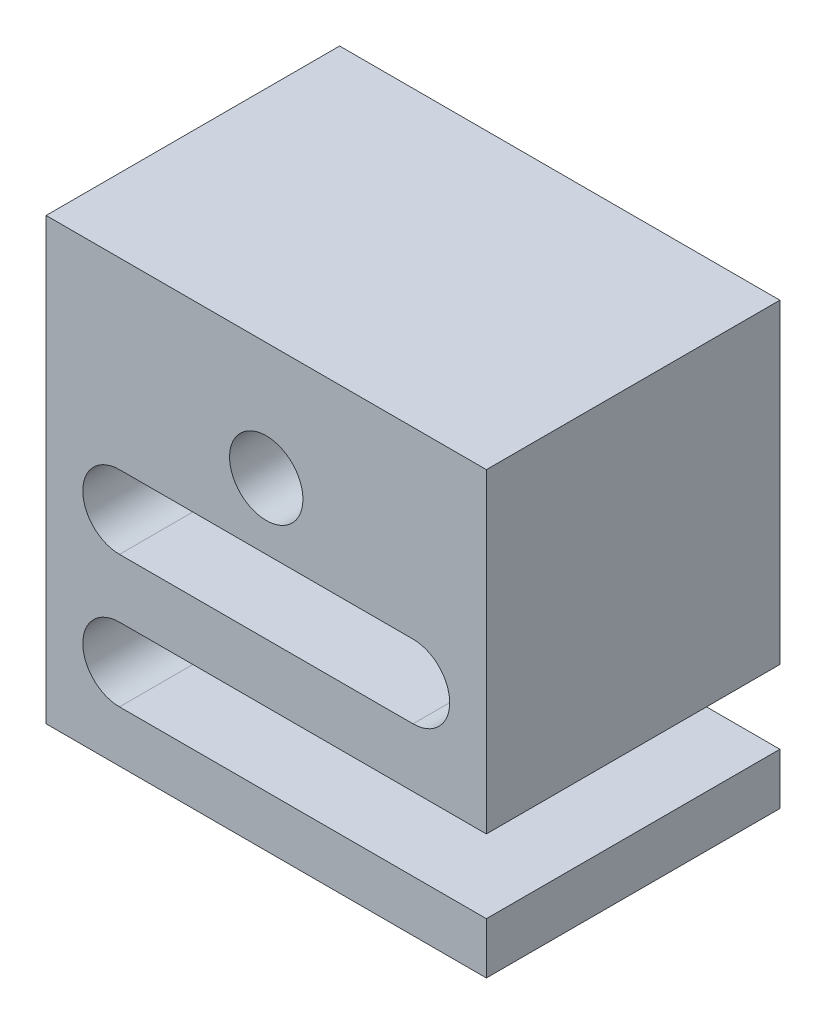
ISO-10303-21;
HEADER;
FILE_DESCRIPTION(('STEP AP214'),'2;1');
FILE_NAME('part.step','',(''),(''),'','','');
FILE_SCHEMA(('AUTOMOTIVE_DESIGN { 1 0 10303 214 1 1 1 1 }'));
ENDSEC;
DATA;
#1=APPLICATION_CONTEXT('core data for automotive mechanical design processes');
#2=APPLICATION_PROTOCOL_DEFINITION('international standard','automotive_design',2000,#1);
#3=PRODUCT_CONTEXT('',#1,'mechanical');
#4=PRODUCT('Part','Part','',(#3));
#5=PRODUCT_RELATED_PRODUCT_CATEGORY('part','',(#4));
#6=PRODUCT_DEFINITION_FORMATION('','',#4);
#7=PRODUCT_DEFINITION_CONTEXT('part definition',#1,'design');
#8=PRODUCT_DEFINITION('design','',#6,#7);
#9=PRODUCT_DEFINITION_SHAPE('','',#8);
#10=(LENGTH_UNIT() NAMED_UNIT(*) SI_UNIT(.MILLI.,.METRE.));
#11=(NAMED_UNIT(*) PLANE_ANGLE_UNIT() SI_UNIT($,.RADIAN.));
#12=(NAMED_UNIT(*) SI_UNIT($,.STERADIAN.) SOLID_ANGLE_UNIT());
#13=UNCERTAINTY_MEASURE_WITH_UNIT(LENGTH_MEASURE(1.E-05),#10,'distance_accuracy_value','');
#14=(GEOMETRIC_REPRESENTATION_CONTEXT(3) GLOBAL_UNCERTAINTY_ASSIGNED_CONTEXT((#13)) GLOBAL_UNIT_ASSIGNED_CONTEXT((#10,
#11,#12)) REPRESENTATION_CONTEXT('',''));
#15=CARTESIAN_POINT('',(0.,0.,0.));
#16=DIRECTION('',(0.,0.,1.));
#17=DIRECTION('',(1.,0.,0.));
#18=AXIS2_PLACEMENT_3D('',#15,#16,#17);
#19=CARTESIAN_POINT('',(19.05,-19.05,12.7));
#20=DIRECTION('',(-1.,0.,0.));
#21=DIRECTION('',(0.,0.,1.));
#22=AXIS2_PLACEMENT_3D('',#19,#20,#21);
#23=PLANE('',#22);
#24=DIRECTION('',(0.,1.,0.));
#25=VECTOR('',#24,1.);
#26=CARTESIAN_POINT('',(19.05,-19.05,12.7));
#27=LINE('',#26,#25);
#28=CARTESIAN_POINT('',(19.05,-8.255,12.7));
#29=VERTEX_POINT('',#28);
#30=CARTESIAN_POINT('',(19.05,19.05,12.7));
#31=VERTEX_POINT('',#30);
#32=EDGE_CURVE('E200',#29,#31,#27,.T.);
#33=ORIENTED_EDGE('',*,*,#32,.F.);
#34=DIRECTION('',(0.,0.,1.));
#35=VECTOR('',#34,1.);
#36=CARTESIAN_POINT('',(19.05,-8.255,-12.7));
#37=LINE('',#36,#35);
#38=CARTESIAN_POINT('',(19.05,-8.255,-12.7));
#39=VERTEX_POINT('',#38);
#40=EDGE_CURVE('E190',#39,#29,#37,.T.);
#41=ORIENTED_EDGE('',*,*,#40,.F.);
#42=DIRECTION('',(0.,1.,0.));
#43=VECTOR('',#42,1.);
#44=CARTESIAN_POINT('',(19.05,-19.05,-12.7));
#45=LINE('',#44,#43);
#46=CARTESIAN_POINT('',(19.05,19.05,-12.7));
#47=VERTEX_POINT('',#46);
#48=EDGE_CURVE('E189',#39,#47,#45,.T.);
#49=ORIENTED_EDGE('',*,*,#48,.T.);
#50=DIRECTION('',(0.,0.,-1.));
#51=VECTOR('',#50,1.);
#52=CARTESIAN_POINT('',(19.05,19.05,12.7));
#53=LINE('',#52,#51);
#54=EDGE_CURVE('E11',#31,#47,#53,.T.);
#55=ORIENTED_EDGE('',*,*,#54,.F.);
#56=EDGE_LOOP('',(#33,#41,#49,#55));
#57=FACE_BOUND('',#56,.T.);
#58=ADVANCED_FACE('F38',(#57),#23,.F.);
#59=CARTESIAN_POINT('',(19.05,-19.05,-12.7));
#60=VERTEX_POINT('',#59);
#61=CARTESIAN_POINT('',(19.05,-14.605,-12.7));
#62=VERTEX_POINT('',#61);
#63=EDGE_CURVE('E207',#60,#62,#45,.T.);
#64=ORIENTED_EDGE('',*,*,#63,.T.);
#65=DIRECTION('',(0.,0.,1.));
#66=VECTOR('',#65,1.);
#67=CARTESIAN_POINT('',(19.05,-14.605,-12.7));
#68=LINE('',#67,#66);
#69=CARTESIAN_POINT('',(19.05,-14.605,12.7));
#70=VERTEX_POINT('',#69);
#71=EDGE_CURVE('E192',#62,#70,#68,.T.);
#72=ORIENTED_EDGE('',*,*,#71,.T.);
#73=CARTESIAN_POINT('',(19.05,-19.05,12.7));
#74=VERTEX_POINT('',#73);
#75=EDGE_CURVE('E196',#74,#70,#27,.T.);
#76=ORIENTED_EDGE('',*,*,#75,.F.);
#77=DIRECTION('',(0.,0.,-1.));
#78=VECTOR('',#77,1.);
#79=CARTESIAN_POINT('',(19.05,-19.05,12.7));
#80=LINE('',#79,#78);
#81=EDGE_CURVE('E206',#74,#60,#80,.T.);
#82=ORIENTED_EDGE('',*,*,#81,.T.);
#83=EDGE_LOOP('',(#64,#72,#76,#82));
#84=FACE_BOUND('',#83,.T.);
#85=ADVANCED_FACE('F40',(#84),#23,.F.);
#86=CARTESIAN_POINT('',(-19.05,19.05,12.7));
#87=DIRECTION('',(0.,-1.,0.));
#88=DIRECTION('',(0.,0.,-1.));
#89=AXIS2_PLACEMENT_3D('',#86,#87,#88);
#90=PLANE('',#89);
#91=DIRECTION('',(-1.,0.,0.));
#92=VECTOR('',#91,1.);
#93=CARTESIAN_POINT('',(-19.05,19.05,-12.7));
#94=LINE('',#93,#92);
#95=CARTESIAN_POINT('',(-19.05,19.05,-12.7));
#96=VERTEX_POINT('',#95);
#97=EDGE_CURVE('E210',#47,#96,#94,.T.);
#98=ORIENTED_EDGE('',*,*,#97,.T.);
#99=DIRECTION('',(0.,0.,-1.));
#100=VECTOR('',#99,1.);
#101=CARTESIAN_POINT('',(-19.05,19.05,12.7));
#102=LINE('',#101,#100);
#103=CARTESIAN_POINT('',(-19.05,19.05,12.7));
#104=VERTEX_POINT('',#103);
#105=EDGE_CURVE('E46',#104,#96,#102,.T.);
#106=ORIENTED_EDGE('',*,*,#105,.F.);
#107=DIRECTION('',(-1.,0.,0.));
#108=VECTOR('',#107,1.);
#109=CARTESIAN_POINT('',(-19.05,19.05,12.7));
#110=LINE('',#109,#108);
#111=EDGE_CURVE('E199',#31,#104,#110,.T.);
#112=ORIENTED_EDGE('',*,*,#111,.F.);
#113=ORIENTED_EDGE('',*,*,#54,.T.);
#114=EDGE_LOOP('',(#98,#106,#112,#113));
#115=FACE_BOUND('',#114,.T.);
#116=ADVANCED_FACE('F247',(#115),#90,.F.);
#117=CARTESIAN_POINT('',(-19.05,-19.05,12.7));
#118=DIRECTION('',(1.,0.,0.));
#119=DIRECTION('',(0.,0.,-1.));
#120=AXIS2_PLACEMENT_3D('',#117,#118,#119);
#121=PLANE('',#120);
#122=DIRECTION('',(0.,-1.,0.));
#123=VECTOR('',#122,1.);
#124=CARTESIAN_POINT('',(-19.05,-19.05,-12.7));
#125=LINE('',#124,#123);
#126=CARTESIAN_POINT('',(-19.05,-19.05,-12.7));
#127=VERTEX_POINT('',#126);
#128=EDGE_CURVE('E212',#96,#127,#125,.T.);
#129=ORIENTED_EDGE('',*,*,#128,.T.);
#130=DIRECTION('',(0.,0.,-1.));
#131=VECTOR('',#130,1.);
#132=CARTESIAN_POINT('',(-19.05,-19.05,12.7));
#133=LINE('',#132,#131);
#134=CARTESIAN_POINT('',(-19.05,-19.05,12.7));
#135=VERTEX_POINT('',#134);
#136=EDGE_CURVE('E218',#135,#127,#133,.T.);
#137=ORIENTED_EDGE('',*,*,#136,.F.);
#138=DIRECTION('',(0.,-1.,0.));
#139=VECTOR('',#138,1.);
#140=CARTESIAN_POINT('',(-19.05,-19.05,12.7));
#141=LINE('',#140,#139);
#142=EDGE_CURVE('E202',#104,#135,#141,.T.);
#143=ORIENTED_EDGE('',*,*,#142,.F.);
#144=ORIENTED_EDGE('',*,*,#105,.T.);
#145=EDGE_LOOP('',(#129,#137,#143,#144));
#146=FACE_BOUND('',#145,.T.);
#147=ADVANCED_FACE('F225',(#146),#121,.F.);
#148=CARTESIAN_POINT('',(-19.05,-19.05,12.7));
#149=DIRECTION('',(0.,1.,0.));
#150=DIRECTION('',(0.,0.,1.));
#151=AXIS2_PLACEMENT_3D('',#148,#149,#150);
#152=PLANE('',#151);
#153=DIRECTION('',(1.,0.,0.));
#154=VECTOR('',#153,1.);
#155=CARTESIAN_POINT('',(-19.05,-19.05,-12.7));
#156=LINE('',#155,#154);
#157=EDGE_CURVE('E214',#127,#60,#156,.T.);
#158=ORIENTED_EDGE('',*,*,#157,.T.);
#159=ORIENTED_EDGE('',*,*,#81,.F.);
#160=DIRECTION('',(1.,0.,0.));
#161=VECTOR('',#160,1.);
#162=CARTESIAN_POINT('',(-19.05,-19.05,12.7));
#163=LINE('',#162,#161);
#164=EDGE_CURVE('E204',#135,#74,#163,.T.);
#165=ORIENTED_EDGE('',*,*,#164,.F.);
#166=ORIENTED_EDGE('',*,*,#136,.T.);
#167=EDGE_LOOP('',(#158,#159,#165,#166));
#168=FACE_BOUND('',#167,.T.);
#169=ADVANCED_FACE('F236',(#168),#152,.F.);
#170=CARTESIAN_POINT('',(0.,0.,12.7));
#171=DIRECTION('',(0.,0.,-1.));
#172=DIRECTION('',(-1.,0.,0.));
#173=AXIS2_PLACEMENT_3D('',#170,#171,#172);
#174=PLANE('',#173);
#175=DIRECTION('',(1.,0.,0.));
#176=VECTOR('',#175,1.);
#177=CARTESIAN_POINT('',(-12.7,-3.175,12.7));
#178=LINE('',#177,#176);
#179=CARTESIAN_POINT('',(-12.7,-3.175,12.7));
#180=VERTEX_POINT('',#179);
#181=CARTESIAN_POINT('',(12.7,-3.175,12.7));
#182=VERTEX_POINT('',#181);
#183=EDGE_CURVE('E154',#180,#182,#178,.T.);
#184=ORIENTED_EDGE('',*,*,#183,.F.);
#185=CARTESIAN_POINT('',(-12.7,0.,12.7));
#186=DIRECTION('',(0.,0.,1.));
#187=DIRECTION('',(1.,0.,0.));
#188=AXIS2_PLACEMENT_3D('',#185,#186,#187);
#189=CIRCLE('',#188,3.175);
#190=CARTESIAN_POINT('',(-12.7,3.175,12.7));
#191=VERTEX_POINT('',#190);
#192=EDGE_CURVE('E53',#191,#180,#189,.T.);
#193=ORIENTED_EDGE('',*,*,#192,.F.);
#194=DIRECTION('',(-1.,0.,0.));
#195=VECTOR('',#194,1.);
#196=CARTESIAN_POINT('',(-12.7,3.175,12.7));
#197=LINE('',#196,#195);
#198=CARTESIAN_POINT('',(12.7,3.175,12.7));
#199=VERTEX_POINT('',#198);
#200=EDGE_CURVE('E145',#199,#191,#197,.T.);
#201=ORIENTED_EDGE('',*,*,#200,.F.);
#202=CARTESIAN_POINT('',(12.7,0.,12.7));
#203=DIRECTION('',(0.,0.,1.));
#204=DIRECTION('',(1.,0.,0.));
#205=AXIS2_PLACEMENT_3D('',#202,#203,#204);
#206=CIRCLE('',#205,3.175);
#207=EDGE_CURVE('E148',#182,#199,#206,.T.);
#208=ORIENTED_EDGE('',*,*,#207,.F.);
#209=EDGE_LOOP('',(#184,#193,#201,#208));
#210=FACE_BOUND('',#209,.T.);
#211=CARTESIAN_POINT('',(0.,8.89,12.7));
#212=DIRECTION('',(0.,0.,1.));
#213=DIRECTION('',(1.,0.,0.));
#214=AXIS2_PLACEMENT_3D('',#211,#212,#213);
#215=CIRCLE('',#214,3.17499999999999);
#216=CARTESIAN_POINT('',(3.17499999999999,8.89,12.7));
#217=VERTEX_POINT('',#216);
#218=EDGE_CURVE('E160',#217,#217,#215,.T.);
#219=ORIENTED_EDGE('',*,*,#218,.F.);
#220=EDGE_LOOP('',(#219));
#221=FACE_BOUND('',#220,.T.);
#222=CARTESIAN_POINT('',(-12.7,-11.43,12.7));
#223=DIRECTION('',(0.,0.,1.));
#224=DIRECTION('',(1.,0.,0.));
#225=AXIS2_PLACEMENT_3D('',#222,#223,#224);
#226=CIRCLE('',#225,3.175);
#227=CARTESIAN_POINT('',(-12.7,-8.255,12.7));
#228=VERTEX_POINT('',#227);
#229=CARTESIAN_POINT('',(-12.7,-14.605,12.7));
#230=VERTEX_POINT('',#229);
#231=EDGE_CURVE('E169',#228,#230,#226,.T.);
#232=ORIENTED_EDGE('',*,*,#231,.F.);
#233=DIRECTION('',(-1.,0.,0.));
#234=VECTOR('',#233,1.);
#235=CARTESIAN_POINT('',(-12.7,-8.255,12.7));
#236=LINE('',#235,#234);
#237=EDGE_CURVE('E174',#29,#228,#236,.T.);
#238=ORIENTED_EDGE('',*,*,#237,.F.);
#239=ORIENTED_EDGE('',*,*,#32,.T.);
#240=ORIENTED_EDGE('',*,*,#111,.T.);
#241=ORIENTED_EDGE('',*,*,#142,.T.);
#242=ORIENTED_EDGE('',*,*,#164,.T.);
#243=ORIENTED_EDGE('',*,*,#75,.T.);
#244=DIRECTION('',(1.,0.,0.));
#245=VECTOR('',#244,1.);
#246=CARTESIAN_POINT('',(-12.7,-14.605,12.7));
#247=LINE('',#246,#245);
#248=EDGE_CURVE('E183',#230,#70,#247,.T.);
#249=ORIENTED_EDGE('',*,*,#248,.F.);
#250=EDGE_LOOP('',(#232,#238,#239,#240,#241,#242,#243,#249));
#251=FACE_BOUND('',#250,.T.);
#252=ADVANCED_FACE('F243',(#210,#221,#251),#174,.F.);
#253=CARTESIAN_POINT('',(0.,0.,-12.7));
#254=DIRECTION('',(0.,0.,-1.));
#255=DIRECTION('',(-1.,0.,0.));
#256=AXIS2_PLACEMENT_3D('',#253,#254,#255);
#257=PLANE('',#256);
#258=CARTESIAN_POINT('',(-12.7,0.,-12.7));
#259=DIRECTION('',(0.,0.,1.));
#260=DIRECTION('',(1.,0.,0.));
#261=AXIS2_PLACEMENT_3D('',#258,#259,#260);
#262=CIRCLE('',#261,3.175);
#263=CARTESIAN_POINT('',(-12.7,3.175,-12.7));
#264=VERTEX_POINT('',#263);
#265=CARTESIAN_POINT('',(-12.7,-3.175,-12.7));
#266=VERTEX_POINT('',#265);
#267=EDGE_CURVE('E129',#264,#266,#262,.T.);
#268=ORIENTED_EDGE('',*,*,#267,.T.);
#269=DIRECTION('',(1.,0.,0.));
#270=VECTOR('',#269,1.);
#271=CARTESIAN_POINT('',(-12.7,-3.175,-12.7));
#272=LINE('',#271,#270);
#273=CARTESIAN_POINT('',(12.7,-3.175,-12.7));
#274=VERTEX_POINT('',#273);
#275=EDGE_CURVE('E138',#266,#274,#272,.T.);
#276=ORIENTED_EDGE('',*,*,#275,.T.);
#277=CARTESIAN_POINT('',(12.7,0.,-12.7));
#278=DIRECTION('',(0.,0.,1.));
#279=DIRECTION('',(1.,0.,0.));
#280=AXIS2_PLACEMENT_3D('',#277,#278,#279);
#281=CIRCLE('',#280,3.175);
#282=CARTESIAN_POINT('',(12.7,3.175,-12.7));
#283=VERTEX_POINT('',#282);
#284=EDGE_CURVE('E61',#274,#283,#281,.T.);
#285=ORIENTED_EDGE('',*,*,#284,.T.);
#286=DIRECTION('',(-1.,0.,0.));
#287=VECTOR('',#286,1.);
#288=CARTESIAN_POINT('',(-12.7,3.175,-12.7));
#289=LINE('',#288,#287);
#290=EDGE_CURVE('E135',#283,#264,#289,.T.);
#291=ORIENTED_EDGE('',*,*,#290,.T.);
#292=EDGE_LOOP('',(#268,#276,#285,#291));
#293=FACE_BOUND('',#292,.T.);
#294=CARTESIAN_POINT('',(0.,8.89,-12.7));
#295=DIRECTION('',(0.,0.,1.));
#296=DIRECTION('',(1.,0.,0.));
#297=AXIS2_PLACEMENT_3D('',#294,#295,#296);
#298=CIRCLE('',#297,3.175);
#299=CARTESIAN_POINT('',(3.175,8.89,-12.7));
#300=VERTEX_POINT('',#299);
#301=EDGE_CURVE('E166',#300,#300,#298,.T.);
#302=ORIENTED_EDGE('',*,*,#301,.T.);
#303=EDGE_LOOP('',(#302));
#304=FACE_BOUND('',#303,.T.);
#305=DIRECTION('',(-1.,0.,0.));
#306=VECTOR('',#305,1.);
#307=CARTESIAN_POINT('',(-12.7,-8.255,-12.7));
#308=LINE('',#307,#306);
#309=CARTESIAN_POINT('',(-12.7,-8.255,-12.7));
#310=VERTEX_POINT('',#309);
#311=EDGE_CURVE('E177',#39,#310,#308,.T.);
#312=ORIENTED_EDGE('',*,*,#311,.T.);
#313=CARTESIAN_POINT('',(-12.7,-11.43,-12.7));
#314=DIRECTION('',(0.,0.,1.));
#315=DIRECTION('',(1.,0.,0.));
#316=AXIS2_PLACEMENT_3D('',#313,#314,#315);
#317=CIRCLE('',#316,3.175);
#318=CARTESIAN_POINT('',(-12.7,-14.605,-12.7));
#319=VERTEX_POINT('',#318);
#320=EDGE_CURVE('E170',#310,#319,#317,.T.);
#321=ORIENTED_EDGE('',*,*,#320,.T.);
#322=DIRECTION('',(1.,0.,0.));
#323=VECTOR('',#322,1.);
#324=CARTESIAN_POINT('',(-12.7,-14.605,-12.7));
#325=LINE('',#324,#323);
#326=EDGE_CURVE('E173',#319,#62,#325,.T.);
#327=ORIENTED_EDGE('',*,*,#326,.T.);
#328=ORIENTED_EDGE('',*,*,#63,.F.);
#329=ORIENTED_EDGE('',*,*,#157,.F.);
#330=ORIENTED_EDGE('',*,*,#128,.F.);
#331=ORIENTED_EDGE('',*,*,#97,.F.);
#332=ORIENTED_EDGE('',*,*,#48,.F.);
#333=EDGE_LOOP('',(#312,#321,#327,#328,#329,#330,#331,#332));
#334=FACE_BOUND('',#333,.T.);
#335=ADVANCED_FACE('F142',(#293,#304,#334),#257,.T.);
#336=CARTESIAN_POINT('',(-12.7,-11.43,-12.7));
#337=DIRECTION('',(0.,0.,1.));
#338=DIRECTION('',(1.,0.,0.));
#339=AXIS2_PLACEMENT_3D('',#336,#337,#338);
#340=CYLINDRICAL_SURFACE('',#339,3.175);
#341=ORIENTED_EDGE('',*,*,#231,.T.);
#342=DIRECTION('',(0.,0.,1.));
#343=VECTOR('',#342,1.);
#344=CARTESIAN_POINT('',(-12.7,-14.605,-12.7));
#345=LINE('',#344,#343);
#346=EDGE_CURVE('E180',#319,#230,#345,.T.);
#347=ORIENTED_EDGE('',*,*,#346,.F.);
#348=ORIENTED_EDGE('',*,*,#320,.F.);
#349=DIRECTION('',(0.,0.,1.));
#350=VECTOR('',#349,1.);
#351=CARTESIAN_POINT('',(-12.7,-8.255,-12.7));
#352=LINE('',#351,#350);
#353=EDGE_CURVE('E187',#310,#228,#352,.T.);
#354=ORIENTED_EDGE('',*,*,#353,.T.);
#355=EDGE_LOOP('',(#341,#347,#348,#354));
#356=FACE_BOUND('',#355,.T.);
#357=ADVANCED_FACE('F254',(#356),#340,.F.);
#358=CARTESIAN_POINT('',(-12.7,-8.255,-12.7));
#359=DIRECTION('',(0.,1.,0.));
#360=DIRECTION('',(0.,0.,1.));
#361=AXIS2_PLACEMENT_3D('',#358,#359,#360);
#362=PLANE('',#361);
#363=ORIENTED_EDGE('',*,*,#237,.T.);
#364=ORIENTED_EDGE('',*,*,#353,.F.);
#365=ORIENTED_EDGE('',*,*,#311,.F.);
#366=ORIENTED_EDGE('',*,*,#40,.T.);
#367=EDGE_LOOP('',(#363,#364,#365,#366));
#368=FACE_BOUND('',#367,.T.);
#369=ADVANCED_FACE('F252',(#368),#362,.F.);
#370=CARTESIAN_POINT('',(-12.7,-14.605,-12.7));
#371=DIRECTION('',(0.,-1.,0.));
#372=DIRECTION('',(0.,0.,-1.));
#373=AXIS2_PLACEMENT_3D('',#370,#371,#372);
#374=PLANE('',#373);
#375=ORIENTED_EDGE('',*,*,#248,.T.);
#376=ORIENTED_EDGE('',*,*,#71,.F.);
#377=ORIENTED_EDGE('',*,*,#326,.F.);
#378=ORIENTED_EDGE('',*,*,#346,.T.);
#379=EDGE_LOOP('',(#375,#376,#377,#378));
#380=FACE_BOUND('',#379,.T.);
#381=ADVANCED_FACE('F257',(#380),#374,.F.);
#382=CARTESIAN_POINT('',(0.,8.89,12.7));
#383=DIRECTION('',(0.,0.,1.));
#384=DIRECTION('',(1.,0.,0.));
#385=AXIS2_PLACEMENT_3D('',#382,#383,#384);
#386=CYLINDRICAL_SURFACE('',#385,3.17499999999999);
#387=ORIENTED_EDGE('',*,*,#301,.F.);
#388=EDGE_LOOP('',(#387));
#389=FACE_BOUND('',#388,.T.);
#390=ORIENTED_EDGE('',*,*,#218,.T.);
#391=EDGE_LOOP('',(#390));
#392=FACE_BOUND('',#391,.T.);
#393=ADVANCED_FACE('F259',(#389,#392),#386,.F.);
#394=CARTESIAN_POINT('',(-12.7,0.,-12.7));
#395=DIRECTION('',(0.,0.,1.));
#396=DIRECTION('',(1.,0.,0.));
#397=AXIS2_PLACEMENT_3D('',#394,#395,#396);
#398=CYLINDRICAL_SURFACE('',#397,3.175);
#399=ORIENTED_EDGE('',*,*,#192,.T.);
#400=DIRECTION('',(0.,0.,1.));
#401=VECTOR('',#400,1.);
#402=CARTESIAN_POINT('',(-12.7,-3.175,-12.7));
#403=LINE('',#402,#401);
#404=EDGE_CURVE('E125',#266,#180,#403,.T.);
#405=ORIENTED_EDGE('',*,*,#404,.F.);
#406=ORIENTED_EDGE('',*,*,#267,.F.);
#407=DIRECTION('',(0.,0.,1.));
#408=VECTOR('',#407,1.);
#409=CARTESIAN_POINT('',(-12.7,3.175,-12.7));
#410=LINE('',#409,#408);
#411=EDGE_CURVE('E158',#264,#191,#410,.T.);
#412=ORIENTED_EDGE('',*,*,#411,.T.);
#413=EDGE_LOOP('',(#399,#405,#406,#412));
#414=FACE_BOUND('',#413,.T.);
#415=ADVANCED_FACE('F127',(#414),#398,.F.);
#416=CARTESIAN_POINT('',(-12.7,3.175,-12.7));
#417=DIRECTION('',(0.,1.,0.));
#418=DIRECTION('',(-1.,0.,0.));
#419=AXIS2_PLACEMENT_3D('',#416,#417,#418);
#420=PLANE('',#419);
#421=ORIENTED_EDGE('',*,*,#200,.T.);
#422=ORIENTED_EDGE('',*,*,#411,.F.);
#423=ORIENTED_EDGE('',*,*,#290,.F.);
#424=DIRECTION('',(0.,0.,1.));
#425=VECTOR('',#424,1.);
#426=CARTESIAN_POINT('',(12.7,3.175,-12.7));
#427=LINE('',#426,#425);
#428=EDGE_CURVE('E161',#283,#199,#427,.T.);
#429=ORIENTED_EDGE('',*,*,#428,.T.);
#430=EDGE_LOOP('',(#421,#422,#423,#429));
#431=FACE_BOUND('',#430,.T.);
#432=ADVANCED_FACE('F321',(#431),#420,.F.);
#433=CARTESIAN_POINT('',(12.7,0.,-12.7));
#434=DIRECTION('',(0.,0.,1.));
#435=DIRECTION('',(1.,0.,0.));
#436=AXIS2_PLACEMENT_3D('',#433,#434,#435);
#437=CYLINDRICAL_SURFACE('',#436,3.175);
#438=ORIENTED_EDGE('',*,*,#207,.T.);
#439=ORIENTED_EDGE('',*,*,#428,.F.);
#440=ORIENTED_EDGE('',*,*,#284,.F.);
#441=DIRECTION('',(0.,0.,1.));
#442=VECTOR('',#441,1.);
#443=CARTESIAN_POINT('',(12.7,-3.175,-12.7));
#444=LINE('',#443,#442);
#445=EDGE_CURVE('E134',#274,#182,#444,.T.);
#446=ORIENTED_EDGE('',*,*,#445,.T.);
#447=EDGE_LOOP('',(#438,#439,#440,#446));
#448=FACE_BOUND('',#447,.T.);
#449=ADVANCED_FACE('F330',(#448),#437,.F.);
#450=CARTESIAN_POINT('',(-12.7,-3.175,-12.7));
#451=DIRECTION('',(0.,-1.,0.));
#452=DIRECTION('',(1.,0.,0.));
#453=AXIS2_PLACEMENT_3D('',#450,#451,#452);
#454=PLANE('',#453);
#455=ORIENTED_EDGE('',*,*,#183,.T.);
#456=ORIENTED_EDGE('',*,*,#445,.F.);
#457=ORIENTED_EDGE('',*,*,#275,.F.);
#458=ORIENTED_EDGE('',*,*,#404,.T.);
#459=EDGE_LOOP('',(#455,#456,#457,#458));
#460=FACE_BOUND('',#459,.T.);
#461=ADVANCED_FACE('F139',(#460),#454,.F.);
#462=CLOSED_SHELL('',(#58,#85,#116,#147,#169,#252,#335,#357,#369,#381,#393,#415,#432,#449,#461));
#463=MANIFOLD_SOLID_BREP('B2',#462);
#464=ADVANCED_BREP_SHAPE_REPRESENTATION('',(#18,#463),#14);
#465=SHAPE_DEFINITION_REPRESENTATION(#9,#464);
ENDSEC;
END-ISO-10303-21;
